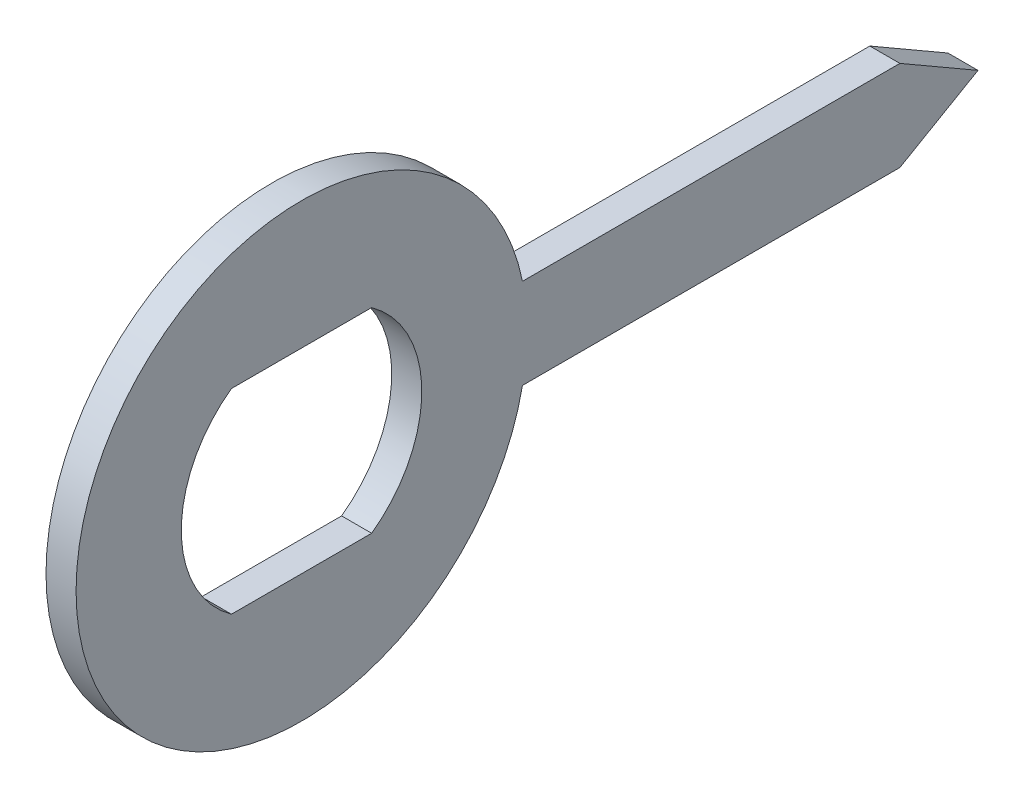
ISO-10303-21;
HEADER;
FILE_DESCRIPTION(('STEP AP214'),'2;1');
FILE_NAME('part.step','',(''),(''),'','','');
FILE_SCHEMA(('AUTOMOTIVE_DESIGN { 1 0 10303 214 1 1 1 1 }'));
ENDSEC;
DATA;
#1=APPLICATION_CONTEXT('core data for automotive mechanical design processes');
#2=APPLICATION_PROTOCOL_DEFINITION('international standard','automotive_design',2000,#1);
#3=PRODUCT_CONTEXT('',#1,'mechanical');
#4=PRODUCT('Part','Part','',(#3));
#5=PRODUCT_RELATED_PRODUCT_CATEGORY('part','',(#4));
#6=PRODUCT_DEFINITION_FORMATION('','',#4);
#7=PRODUCT_DEFINITION_CONTEXT('part definition',#1,'design');
#8=PRODUCT_DEFINITION('design','',#6,#7);
#9=PRODUCT_DEFINITION_SHAPE('','',#8);
#10=(LENGTH_UNIT() NAMED_UNIT(*) SI_UNIT(.MILLI.,.METRE.));
#11=(NAMED_UNIT(*) PLANE_ANGLE_UNIT() SI_UNIT($,.RADIAN.));
#12=(NAMED_UNIT(*) SI_UNIT($,.STERADIAN.) SOLID_ANGLE_UNIT());
#13=UNCERTAINTY_MEASURE_WITH_UNIT(LENGTH_MEASURE(1.E-05),#10,'distance_accuracy_value','');
#14=(GEOMETRIC_REPRESENTATION_CONTEXT(3) GLOBAL_UNCERTAINTY_ASSIGNED_CONTEXT((#13)) GLOBAL_UNIT_ASSIGNED_CONTEXT((#10,
#11,#12)) REPRESENTATION_CONTEXT('',''));
#15=CARTESIAN_POINT('',(0.,0.,0.));
#16=DIRECTION('',(0.,0.,1.));
#17=DIRECTION('',(1.,0.,0.));
#18=AXIS2_PLACEMENT_3D('',#15,#16,#17);
#19=CARTESIAN_POINT('',(2.,0.,0.));
#20=DIRECTION('',(1.,0.,0.));
#21=DIRECTION('',(0.,0.,-1.));
#22=AXIS2_PLACEMENT_3D('',#19,#20,#21);
#23=PLANE('',#22);
#24=DIRECTION('',(0.,0.499999999999995,-0.866025403784441));
#25=VECTOR('',#24,1.);
#26=CARTESIAN_POINT('',(2.,0.,-45.));
#27=LINE('',#26,#25);
#28=CARTESIAN_POINT('',(2.,-3.,-39.8038475772933));
#29=VERTEX_POINT('',#28);
#30=CARTESIAN_POINT('',(2.,0.,-45.));
#31=VERTEX_POINT('',#30);
#32=EDGE_CURVE('E140',#29,#31,#27,.T.);
#33=ORIENTED_EDGE('',*,*,#32,.T.);
#34=DIRECTION('',(0.,0.499999999999995,0.866025403784442));
#35=VECTOR('',#34,1.);
#36=CARTESIAN_POINT('',(2.,0.,-45.));
#37=LINE('',#36,#35);
#38=CARTESIAN_POINT('',(2.,3.,-39.8038475772933));
#39=VERTEX_POINT('',#38);
#40=EDGE_CURVE('E143',#31,#39,#37,.T.);
#41=ORIENTED_EDGE('',*,*,#40,.T.);
#42=DIRECTION('',(0.,0.,1.));
#43=VECTOR('',#42,1.);
#44=CARTESIAN_POINT('',(2.,3.,-14.6969384566991));
#45=LINE('',#44,#43);
#46=CARTESIAN_POINT('',(2.,3.,-14.6969384566991));
#47=VERTEX_POINT('',#46);
#48=EDGE_CURVE('E146',#39,#47,#45,.T.);
#49=ORIENTED_EDGE('',*,*,#48,.T.);
#50=CARTESIAN_POINT('',(2.,0.,0.));
#51=DIRECTION('',(1.,0.,0.));
#52=DIRECTION('',(0.,0.,-1.));
#53=AXIS2_PLACEMENT_3D('',#50,#51,#52);
#54=CIRCLE('',#53,15.);
#55=CARTESIAN_POINT('',(2.,-3.,-14.6969384566991));
#56=VERTEX_POINT('',#55);
#57=EDGE_CURVE('E148',#47,#56,#54,.T.);
#58=ORIENTED_EDGE('',*,*,#57,.T.);
#59=DIRECTION('',(0.,0.,-1.));
#60=VECTOR('',#59,1.);
#61=CARTESIAN_POINT('',(2.,-3.,-14.6969384566991));
#62=LINE('',#61,#60);
#63=EDGE_CURVE('E150',#56,#29,#62,.T.);
#64=ORIENTED_EDGE('',*,*,#63,.T.);
#65=EDGE_LOOP('',(#33,#41,#49,#58,#64));
#66=FACE_BOUND('',#65,.T.);
#67=DIRECTION('',(0.,0.,1.));
#68=VECTOR('',#67,1.);
#69=CARTESIAN_POINT('',(2.,6.5,4.66368952654441));
#70=LINE('',#69,#68);
#71=CARTESIAN_POINT('',(2.,6.5,-4.66368952654441));
#72=VERTEX_POINT('',#71);
#73=CARTESIAN_POINT('',(2.,6.5,4.66368952654441));
#74=VERTEX_POINT('',#73);
#75=EDGE_CURVE('E112',#72,#74,#70,.T.);
#76=ORIENTED_EDGE('',*,*,#75,.F.);
#77=CARTESIAN_POINT('',(2.,0.,0.));
#78=DIRECTION('',(1.,0.,0.));
#79=DIRECTION('',(0.,0.,-1.));
#80=AXIS2_PLACEMENT_3D('',#77,#78,#79);
#81=CIRCLE('',#80,8.);
#82=CARTESIAN_POINT('',(2.,-6.5,-4.66368952654441));
#83=VERTEX_POINT('',#82);
#84=EDGE_CURVE('E104',#83,#72,#81,.T.);
#85=ORIENTED_EDGE('',*,*,#84,.F.);
#86=DIRECTION('',(0.,0.,-1.));
#87=VECTOR('',#86,1.);
#88=CARTESIAN_POINT('',(2.,-6.5,4.66368952654441));
#89=LINE('',#88,#87);
#90=CARTESIAN_POINT('',(2.,-6.5,4.66368952654441));
#91=VERTEX_POINT('',#90);
#92=EDGE_CURVE('E126',#91,#83,#89,.T.);
#93=ORIENTED_EDGE('',*,*,#92,.F.);
#94=CARTESIAN_POINT('',(2.,0.,0.));
#95=DIRECTION('',(1.,0.,0.));
#96=DIRECTION('',(0.,0.,-1.));
#97=AXIS2_PLACEMENT_3D('',#94,#95,#96);
#98=CIRCLE('',#97,8.);
#99=EDGE_CURVE('E124',#74,#91,#98,.T.);
#100=ORIENTED_EDGE('',*,*,#99,.F.);
#101=EDGE_LOOP('',(#76,#85,#93,#100));
#102=FACE_BOUND('',#101,.T.);
#103=ADVANCED_FACE('F33',(#66,#102),#23,.T.);
#104=CARTESIAN_POINT('',(0.,0.,0.));
#105=DIRECTION('',(1.,0.,0.));
#106=DIRECTION('',(0.,0.,-1.));
#107=AXIS2_PLACEMENT_3D('',#104,#105,#106);
#108=PLANE('',#107);
#109=DIRECTION('',(0.,0.499999999999995,-0.866025403784441));
#110=VECTOR('',#109,1.);
#111=CARTESIAN_POINT('',(0.,0.,-45.));
#112=LINE('',#111,#110);
#113=CARTESIAN_POINT('',(0.,-3.,-39.8038475772933));
#114=VERTEX_POINT('',#113);
#115=CARTESIAN_POINT('',(0.,0.,-45.));
#116=VERTEX_POINT('',#115);
#117=EDGE_CURVE('E120',#114,#116,#112,.T.);
#118=ORIENTED_EDGE('',*,*,#117,.F.);
#119=DIRECTION('',(0.,0.,-1.));
#120=VECTOR('',#119,1.);
#121=CARTESIAN_POINT('',(0.,-3.,-14.6969384566991));
#122=LINE('',#121,#120);
#123=CARTESIAN_POINT('',(0.,-3.,-14.6969384566991));
#124=VERTEX_POINT('',#123);
#125=EDGE_CURVE('E144',#124,#114,#122,.T.);
#126=ORIENTED_EDGE('',*,*,#125,.F.);
#127=CARTESIAN_POINT('',(0.,0.,0.));
#128=DIRECTION('',(1.,0.,0.));
#129=DIRECTION('',(0.,0.,-1.));
#130=AXIS2_PLACEMENT_3D('',#127,#128,#129);
#131=CIRCLE('',#130,15.);
#132=CARTESIAN_POINT('',(0.,3.,-14.6969384566991));
#133=VERTEX_POINT('',#132);
#134=EDGE_CURVE('E159',#133,#124,#131,.T.);
#135=ORIENTED_EDGE('',*,*,#134,.F.);
#136=DIRECTION('',(0.,0.,1.));
#137=VECTOR('',#136,1.);
#138=CARTESIAN_POINT('',(0.,3.,-14.6969384566991));
#139=LINE('',#138,#137);
#140=CARTESIAN_POINT('',(0.,3.,-39.8038475772933));
#141=VERTEX_POINT('',#140);
#142=EDGE_CURVE('E157',#141,#133,#139,.T.);
#143=ORIENTED_EDGE('',*,*,#142,.F.);
#144=DIRECTION('',(0.,0.499999999999995,0.866025403784442));
#145=VECTOR('',#144,1.);
#146=CARTESIAN_POINT('',(0.,0.,-45.));
#147=LINE('',#146,#145);
#148=EDGE_CURVE('E155',#116,#141,#147,.T.);
#149=ORIENTED_EDGE('',*,*,#148,.F.);
#150=EDGE_LOOP('',(#118,#126,#135,#143,#149));
#151=FACE_BOUND('',#150,.T.);
#152=CARTESIAN_POINT('',(0.,0.,0.));
#153=DIRECTION('',(1.,0.,0.));
#154=DIRECTION('',(0.,0.,-1.));
#155=AXIS2_PLACEMENT_3D('',#152,#153,#154);
#156=CIRCLE('',#155,8.);
#157=CARTESIAN_POINT('',(0.,-6.5,-4.66368952654441));
#158=VERTEX_POINT('',#157);
#159=CARTESIAN_POINT('',(0.,6.5,-4.66368952654441));
#160=VERTEX_POINT('',#159);
#161=EDGE_CURVE('E56',#158,#160,#156,.T.);
#162=ORIENTED_EDGE('',*,*,#161,.T.);
#163=DIRECTION('',(0.,0.,1.));
#164=VECTOR('',#163,1.);
#165=CARTESIAN_POINT('',(0.,6.5,4.66368952654441));
#166=LINE('',#165,#164);
#167=CARTESIAN_POINT('',(0.,6.5,4.66368952654441));
#168=VERTEX_POINT('',#167);
#169=EDGE_CURVE('E119',#160,#168,#166,.T.);
#170=ORIENTED_EDGE('',*,*,#169,.T.);
#171=CARTESIAN_POINT('',(0.,0.,0.));
#172=DIRECTION('',(1.,0.,0.));
#173=DIRECTION('',(0.,0.,-1.));
#174=AXIS2_PLACEMENT_3D('',#171,#172,#173);
#175=CIRCLE('',#174,8.);
#176=CARTESIAN_POINT('',(0.,-6.5,4.66368952654441));
#177=VERTEX_POINT('',#176);
#178=EDGE_CURVE('E132',#168,#177,#175,.T.);
#179=ORIENTED_EDGE('',*,*,#178,.T.);
#180=DIRECTION('',(0.,0.,-1.));
#181=VECTOR('',#180,1.);
#182=CARTESIAN_POINT('',(0.,-6.5,4.66368952654441));
#183=LINE('',#182,#181);
#184=EDGE_CURVE('E113',#177,#158,#183,.T.);
#185=ORIENTED_EDGE('',*,*,#184,.T.);
#186=EDGE_LOOP('',(#162,#170,#179,#185));
#187=FACE_BOUND('',#186,.T.);
#188=ADVANCED_FACE('F180',(#151,#187),#108,.F.);
#189=CARTESIAN_POINT('',(2.,0.,-45.));
#190=DIRECTION('',(0.,0.866025403784441,0.499999999999995));
#191=DIRECTION('',(0.,-0.499999999999995,0.866025403784441));
#192=AXIS2_PLACEMENT_3D('',#189,#190,#191);
#193=PLANE('',#192);
#194=ORIENTED_EDGE('',*,*,#117,.T.);
#195=DIRECTION('',(-1.,0.,0.));
#196=VECTOR('',#195,1.);
#197=CARTESIAN_POINT('',(2.,0.,-45.));
#198=LINE('',#197,#196);
#199=EDGE_CURVE('E11',#31,#116,#198,.T.);
#200=ORIENTED_EDGE('',*,*,#199,.F.);
#201=ORIENTED_EDGE('',*,*,#32,.F.);
#202=DIRECTION('',(-1.,0.,0.));
#203=VECTOR('',#202,1.);
#204=CARTESIAN_POINT('',(2.,-3.,-39.8038475772933));
#205=LINE('',#204,#203);
#206=EDGE_CURVE('E152',#29,#114,#205,.T.);
#207=ORIENTED_EDGE('',*,*,#206,.T.);
#208=EDGE_LOOP('',(#194,#200,#201,#207));
#209=FACE_BOUND('',#208,.T.);
#210=ADVANCED_FACE('F35',(#209),#193,.F.);
#211=CARTESIAN_POINT('',(2.,0.,-45.));
#212=DIRECTION('',(0.,-0.866025403784442,0.499999999999995));
#213=DIRECTION('',(0.,-0.499999999999995,-0.866025403784442));
#214=AXIS2_PLACEMENT_3D('',#211,#212,#213);
#215=PLANE('',#214);
#216=ORIENTED_EDGE('',*,*,#148,.T.);
#217=DIRECTION('',(-1.,0.,0.));
#218=VECTOR('',#217,1.);
#219=CARTESIAN_POINT('',(2.,3.,-39.8038475772933));
#220=LINE('',#219,#218);
#221=EDGE_CURVE('E41',#39,#141,#220,.T.);
#222=ORIENTED_EDGE('',*,*,#221,.F.);
#223=ORIENTED_EDGE('',*,*,#40,.F.);
#224=ORIENTED_EDGE('',*,*,#199,.T.);
#225=EDGE_LOOP('',(#216,#222,#223,#224));
#226=FACE_BOUND('',#225,.T.);
#227=ADVANCED_FACE('F194',(#226),#215,.F.);
#228=CARTESIAN_POINT('',(2.,3.,-14.6969384566991));
#229=DIRECTION('',(0.,-1.,0.));
#230=DIRECTION('',(0.,0.,-1.));
#231=AXIS2_PLACEMENT_3D('',#228,#229,#230);
#232=PLANE('',#231);
#233=ORIENTED_EDGE('',*,*,#142,.T.);
#234=DIRECTION('',(-1.,0.,0.));
#235=VECTOR('',#234,1.);
#236=CARTESIAN_POINT('',(2.,3.,-14.6969384566991));
#237=LINE('',#236,#235);
#238=EDGE_CURVE('E167',#47,#133,#237,.T.);
#239=ORIENTED_EDGE('',*,*,#238,.F.);
#240=ORIENTED_EDGE('',*,*,#48,.F.);
#241=ORIENTED_EDGE('',*,*,#221,.T.);
#242=EDGE_LOOP('',(#233,#239,#240,#241));
#243=FACE_BOUND('',#242,.T.);
#244=ADVANCED_FACE('F174',(#243),#232,.F.);
#245=CARTESIAN_POINT('',(2.,0.,0.));
#246=DIRECTION('',(-1.,0.,0.));
#247=DIRECTION('',(0.,0.,1.));
#248=AXIS2_PLACEMENT_3D('',#245,#246,#247);
#249=CYLINDRICAL_SURFACE('',#248,15.);
#250=ORIENTED_EDGE('',*,*,#134,.T.);
#251=DIRECTION('',(-1.,0.,0.));
#252=VECTOR('',#251,1.);
#253=CARTESIAN_POINT('',(2.,-3.,-14.6969384566991));
#254=LINE('',#253,#252);
#255=EDGE_CURVE('E164',#56,#124,#254,.T.);
#256=ORIENTED_EDGE('',*,*,#255,.F.);
#257=ORIENTED_EDGE('',*,*,#57,.F.);
#258=ORIENTED_EDGE('',*,*,#238,.T.);
#259=EDGE_LOOP('',(#250,#256,#257,#258));
#260=FACE_BOUND('',#259,.T.);
#261=ADVANCED_FACE('F185',(#260),#249,.T.);
#262=CARTESIAN_POINT('',(2.,-3.,-14.6969384566991));
#263=DIRECTION('',(0.,1.,0.));
#264=DIRECTION('',(0.,0.,1.));
#265=AXIS2_PLACEMENT_3D('',#262,#263,#264);
#266=PLANE('',#265);
#267=ORIENTED_EDGE('',*,*,#125,.T.);
#268=ORIENTED_EDGE('',*,*,#206,.F.);
#269=ORIENTED_EDGE('',*,*,#63,.F.);
#270=ORIENTED_EDGE('',*,*,#255,.T.);
#271=EDGE_LOOP('',(#267,#268,#269,#270));
#272=FACE_BOUND('',#271,.T.);
#273=ADVANCED_FACE('F189',(#272),#266,.F.);
#274=CARTESIAN_POINT('',(2.,0.,0.));
#275=DIRECTION('',(-1.,0.,0.));
#276=DIRECTION('',(0.,0.,1.));
#277=AXIS2_PLACEMENT_3D('',#274,#275,#276);
#278=CYLINDRICAL_SURFACE('',#277,8.);
#279=ORIENTED_EDGE('',*,*,#161,.F.);
#280=DIRECTION('',(-1.,0.,0.));
#281=VECTOR('',#280,1.);
#282=CARTESIAN_POINT('',(2.,-6.5,-4.66368952654441));
#283=LINE('',#282,#281);
#284=EDGE_CURVE('E108',#83,#158,#283,.T.);
#285=ORIENTED_EDGE('',*,*,#284,.F.);
#286=ORIENTED_EDGE('',*,*,#84,.T.);
#287=DIRECTION('',(-1.,0.,0.));
#288=VECTOR('',#287,1.);
#289=CARTESIAN_POINT('',(2.,6.5,-4.66368952654441));
#290=LINE('',#289,#288);
#291=EDGE_CURVE('E107',#72,#160,#290,.T.);
#292=ORIENTED_EDGE('',*,*,#291,.T.);
#293=EDGE_LOOP('',(#279,#285,#286,#292));
#294=FACE_BOUND('',#293,.T.);
#295=ADVANCED_FACE('F106',(#294),#278,.F.);
#296=CARTESIAN_POINT('',(2.,6.5,4.66368952654441));
#297=DIRECTION('',(0.,-1.,0.));
#298=DIRECTION('',(0.,0.,-1.));
#299=AXIS2_PLACEMENT_3D('',#296,#297,#298);
#300=PLANE('',#299);
#301=ORIENTED_EDGE('',*,*,#169,.F.);
#302=ORIENTED_EDGE('',*,*,#291,.F.);
#303=ORIENTED_EDGE('',*,*,#75,.T.);
#304=DIRECTION('',(-1.,0.,0.));
#305=VECTOR('',#304,1.);
#306=CARTESIAN_POINT('',(2.,6.5,4.66368952654441));
#307=LINE('',#306,#305);
#308=EDGE_CURVE('E121',#74,#168,#307,.T.);
#309=ORIENTED_EDGE('',*,*,#308,.T.);
#310=EDGE_LOOP('',(#301,#302,#303,#309));
#311=FACE_BOUND('',#310,.T.);
#312=ADVANCED_FACE('F116',(#311),#300,.T.);
#313=CARTESIAN_POINT('',(2.,0.,0.));
#314=DIRECTION('',(-1.,0.,0.));
#315=DIRECTION('',(0.,0.,1.));
#316=AXIS2_PLACEMENT_3D('',#313,#314,#315);
#317=CYLINDRICAL_SURFACE('',#316,8.);
#318=ORIENTED_EDGE('',*,*,#178,.F.);
#319=ORIENTED_EDGE('',*,*,#308,.F.);
#320=ORIENTED_EDGE('',*,*,#99,.T.);
#321=DIRECTION('',(-1.,0.,0.));
#322=VECTOR('',#321,1.);
#323=CARTESIAN_POINT('',(2.,-6.5,4.66368952654441));
#324=LINE('',#323,#322);
#325=EDGE_CURVE('E48',#91,#177,#324,.T.);
#326=ORIENTED_EDGE('',*,*,#325,.T.);
#327=EDGE_LOOP('',(#318,#319,#320,#326));
#328=FACE_BOUND('',#327,.T.);
#329=ADVANCED_FACE('F237',(#328),#317,.F.);
#330=CARTESIAN_POINT('',(2.,-6.5,4.66368952654441));
#331=DIRECTION('',(0.,1.,0.));
#332=DIRECTION('',(0.,0.,1.));
#333=AXIS2_PLACEMENT_3D('',#330,#331,#332);
#334=PLANE('',#333);
#335=ORIENTED_EDGE('',*,*,#184,.F.);
#336=ORIENTED_EDGE('',*,*,#325,.F.);
#337=ORIENTED_EDGE('',*,*,#92,.T.);
#338=ORIENTED_EDGE('',*,*,#284,.T.);
#339=EDGE_LOOP('',(#335,#336,#337,#338));
#340=FACE_BOUND('',#339,.T.);
#341=ADVANCED_FACE('F243',(#340),#334,.T.);
#342=CLOSED_SHELL('',(#103,#188,#210,#227,#244,#261,#273,#295,#312,#329,#341));
#343=MANIFOLD_SOLID_BREP('B2',#342);
#344=ADVANCED_BREP_SHAPE_REPRESENTATION('',(#18,#343),#14);
#345=SHAPE_DEFINITION_REPRESENTATION(#9,#344);
ENDSEC;
END-ISO-10303-21;
